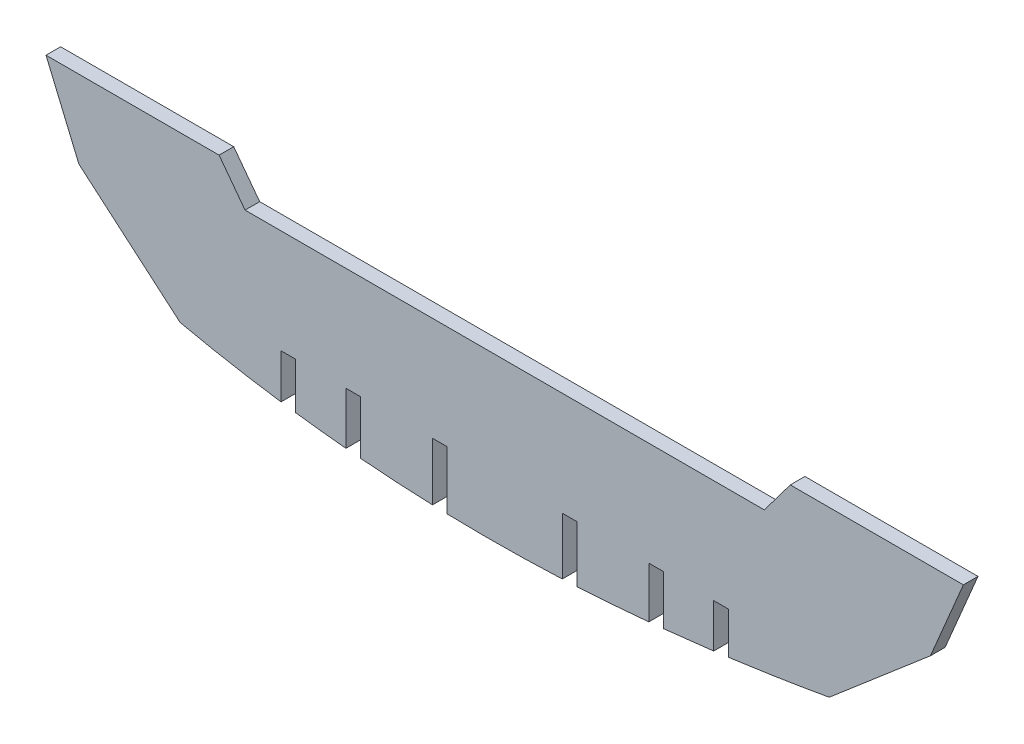
ISO-10303-21;
HEADER;
FILE_DESCRIPTION(('STEP AP214'),'2;1');
FILE_NAME('part.step','',(''),(''),'','','');
FILE_SCHEMA(('AUTOMOTIVE_DESIGN { 1 0 10303 214 1 1 1 1 }'));
ENDSEC;
DATA;
#1=APPLICATION_CONTEXT('core data for automotive mechanical design processes');
#2=APPLICATION_PROTOCOL_DEFINITION('international standard','automotive_design',2000,#1);
#3=PRODUCT_CONTEXT('',#1,'mechanical');
#4=PRODUCT('Part','Part','',(#3));
#5=PRODUCT_RELATED_PRODUCT_CATEGORY('part','',(#4));
#6=PRODUCT_DEFINITION_FORMATION('','',#4);
#7=PRODUCT_DEFINITION_CONTEXT('part definition',#1,'design');
#8=PRODUCT_DEFINITION('design','',#6,#7);
#9=PRODUCT_DEFINITION_SHAPE('','',#8);
#10=(LENGTH_UNIT() NAMED_UNIT(*) SI_UNIT(.MILLI.,.METRE.));
#11=(NAMED_UNIT(*) PLANE_ANGLE_UNIT() SI_UNIT($,.RADIAN.));
#12=(NAMED_UNIT(*) SI_UNIT($,.STERADIAN.) SOLID_ANGLE_UNIT());
#13=UNCERTAINTY_MEASURE_WITH_UNIT(LENGTH_MEASURE(1.E-05),#10,'distance_accuracy_value','');
#14=(GEOMETRIC_REPRESENTATION_CONTEXT(3) GLOBAL_UNCERTAINTY_ASSIGNED_CONTEXT((#13)) GLOBAL_UNIT_ASSIGNED_CONTEXT((#10,
#11,#12)) REPRESENTATION_CONTEXT('',''));
#15=CARTESIAN_POINT('',(0.,0.,0.));
#16=DIRECTION('',(0.,0.,1.));
#17=DIRECTION('',(1.,0.,0.));
#18=AXIS2_PLACEMENT_3D('',#15,#16,#17);
#19=CARTESIAN_POINT('',(-95.25,-19.05,4.2926));
#20=CARTESIAN_POINT('',(-66.0792350111344,-25.5146809383429,4.2926));
#21=CARTESIAN_POINT('',(-2.12159073980995,-32.083739423019,4.2926));
#22=CARTESIAN_POINT('',(61.7618618980102,-25.0102467709334,4.2926));
#23=CARTESIAN_POINT('',(95.25,-19.05,4.2926));
#24=B_SPLINE_CURVE_WITH_KNOTS('',3,(#19,#20,#21,#22,#23),.UNSPECIFIED.,.F.,.F.,(4,1,4),(0.,
0.46719867774018,1.),.UNSPECIFIED.);
#25=DIRECTION('',(0.,0.,-1.));
#26=VECTOR('',#25,1.);
#27=SURFACE_OF_LINEAR_EXTRUSION('',#24,#26);
#28=CARTESIAN_POINT('',(-61.3537,-25.0213087322138,4.2926));
#29=VERTEX_POINT('',#28);
#30=CARTESIAN_POINT('',(-46.5963,-26.7045433789957,4.2926));
#31=VERTEX_POINT('',#30);
#32=EDGE_CURVE('E399',#29,#31,#24,.T.);
#33=ORIENTED_EDGE('',*,*,#32,.F.);
#34=DIRECTION('',(0.,0.,-1.));
#35=VECTOR('',#34,1.);
#36=CARTESIAN_POINT('',(-61.3537,-25.0213087322138,4.2926));
#37=LINE('',#36,#35);
#38=CARTESIAN_POINT('',(-61.3537,-25.0213087322138,0.));
#39=VERTEX_POINT('',#38);
#40=EDGE_CURVE('E385',#29,#39,#37,.T.);
#41=ORIENTED_EDGE('',*,*,#40,.T.);
#42=CARTESIAN_POINT('',(-95.25,-19.05,0.));
#43=CARTESIAN_POINT('',(-66.0792350111344,-25.5146809383429,0.));
#44=CARTESIAN_POINT('',(-2.12159073980995,-32.083739423019,0.));
#45=CARTESIAN_POINT('',(61.7618618980102,-25.0102467709334,0.));
#46=CARTESIAN_POINT('',(95.25,-19.05,0.));
#47=B_SPLINE_CURVE_WITH_KNOTS('',3,(#42,#43,#44,#45,#46),.UNSPECIFIED.,.F.,.F.,(4,1,4),(0.,
0.46719867774018,1.),.UNSPECIFIED.);
#48=CARTESIAN_POINT('',(-46.5963,-26.7045433789957,0.));
#49=VERTEX_POINT('',#48);
#50=EDGE_CURVE('E279',#39,#49,#47,.T.);
#51=ORIENTED_EDGE('',*,*,#50,.T.);
#52=DIRECTION('',(0.,0.,-1.));
#53=VECTOR('',#52,1.);
#54=CARTESIAN_POINT('',(-46.5963,-26.7045433789957,4.2926));
#55=LINE('',#54,#53);
#56=EDGE_CURVE('E442',#49,#31,#55,.F.);
#57=ORIENTED_EDGE('',*,*,#56,.T.);
#58=EDGE_LOOP('',(#33,#41,#51,#57));
#59=FACE_BOUND('',#58,.T.);
#60=ADVANCED_FACE('F37',(#59),#27,.F.);
#61=CARTESIAN_POINT('',(21.1963,-27.9476728082947,4.2926));
#62=VERTEX_POINT('',#61);
#63=CARTESIAN_POINT('',(42.3037,-26.3654884719397,4.2926));
#64=VERTEX_POINT('',#63);
#65=EDGE_CURVE('E380',#62,#64,#24,.T.);
#66=ORIENTED_EDGE('',*,*,#65,.F.);
#67=DIRECTION('',(0.,0.,-1.));
#68=VECTOR('',#67,1.);
#69=CARTESIAN_POINT('',(21.1963,-27.9476728082947,4.2926));
#70=LINE('',#69,#68);
#71=CARTESIAN_POINT('',(21.1963,-27.9476728082947,0.));
#72=VERTEX_POINT('',#71);
#73=EDGE_CURVE('E371',#62,#72,#70,.T.);
#74=ORIENTED_EDGE('',*,*,#73,.T.);
#75=CARTESIAN_POINT('',(42.3037,-26.3654884719397,0.));
#76=VERTEX_POINT('',#75);
#77=EDGE_CURVE('E367',#72,#76,#47,.T.);
#78=ORIENTED_EDGE('',*,*,#77,.T.);
#79=DIRECTION('',(0.,0.,-1.));
#80=VECTOR('',#79,1.);
#81=CARTESIAN_POINT('',(42.3037,-26.3654884719397,4.2926));
#82=LINE('',#81,#80);
#83=EDGE_CURVE('E533',#76,#64,#82,.F.);
#84=ORIENTED_EDGE('',*,*,#83,.T.);
#85=EDGE_LOOP('',(#66,#74,#78,#84));
#86=FACE_BOUND('',#85,.T.);
#87=ADVANCED_FACE('F377',(#86),#27,.F.);
#88=CARTESIAN_POINT('',(65.6463,-23.6876563359909,4.2926));
#89=VERTEX_POINT('',#88);
#90=CARTESIAN_POINT('',(95.25,-19.05,4.2926));
#91=VERTEX_POINT('',#90);
#92=EDGE_CURVE('E325',#89,#91,#24,.T.);
#93=ORIENTED_EDGE('',*,*,#92,.F.);
#94=DIRECTION('',(0.,0.,-1.));
#95=VECTOR('',#94,1.);
#96=CARTESIAN_POINT('',(65.6463,-23.687656335991,4.2926));
#97=LINE('',#96,#95);
#98=CARTESIAN_POINT('',(65.6463,-23.6876563359909,0.));
#99=VERTEX_POINT('',#98);
#100=EDGE_CURVE('E388',#89,#99,#97,.T.);
#101=ORIENTED_EDGE('',*,*,#100,.T.);
#102=CARTESIAN_POINT('',(95.25,-19.05,0.));
#103=VERTEX_POINT('',#102);
#104=EDGE_CURVE('E289',#99,#103,#47,.T.);
#105=ORIENTED_EDGE('',*,*,#104,.T.);
#106=DIRECTION('',(0.,0.,-1.));
#107=VECTOR('',#106,1.);
#108=CARTESIAN_POINT('',(95.25,-19.05,4.2926));
#109=LINE('',#108,#107);
#110=EDGE_CURVE('E346',#91,#103,#109,.T.);
#111=ORIENTED_EDGE('',*,*,#110,.F.);
#112=EDGE_LOOP('',(#93,#101,#105,#111));
#113=FACE_BOUND('',#112,.T.);
#114=ADVANCED_FACE('F544',(#113),#27,.F.);
#115=CARTESIAN_POINT('',(46.5963,-25.9432766219604,0.));
#116=VERTEX_POINT('',#115);
#117=CARTESIAN_POINT('',(61.3537,-24.2486576336705,0.));
#118=VERTEX_POINT('',#117);
#119=EDGE_CURVE('E549',#116,#118,#47,.T.);
#120=ORIENTED_EDGE('',*,*,#119,.T.);
#121=DIRECTION('',(0.,0.,-1.));
#122=VECTOR('',#121,1.);
#123=CARTESIAN_POINT('',(61.3537,-24.2486576336705,4.2926));
#124=LINE('',#123,#122);
#125=CARTESIAN_POINT('',(61.3537,-24.2486576336705,4.2926));
#126=VERTEX_POINT('',#125);
#127=EDGE_CURVE('E538',#118,#126,#124,.F.);
#128=ORIENTED_EDGE('',*,*,#127,.T.);
#129=CARTESIAN_POINT('',(46.5963,-25.9432766219604,4.2926));
#130=VERTEX_POINT('',#129);
#131=EDGE_CURVE('E591',#130,#126,#24,.T.);
#132=ORIENTED_EDGE('',*,*,#131,.F.);
#133=DIRECTION('',(0.,0.,-1.));
#134=VECTOR('',#133,1.);
#135=CARTESIAN_POINT('',(46.5963000000001,-25.9432766219604,4.2926));
#136=LINE('',#135,#134);
#137=EDGE_CURVE('E535',#130,#116,#136,.T.);
#138=ORIENTED_EDGE('',*,*,#137,.T.);
#139=EDGE_LOOP('',(#120,#128,#132,#138));
#140=FACE_BOUND('',#139,.T.);
#141=ADVANCED_FACE('F650',(#140),#27,.F.);
#142=CARTESIAN_POINT('',(-16.9037,-28.5176362998393,0.));
#143=VERTEX_POINT('',#142);
#144=CARTESIAN_POINT('',(16.9037,-28.1643569932418,0.));
#145=VERTEX_POINT('',#144);
#146=EDGE_CURVE('E291',#143,#145,#47,.T.);
#147=ORIENTED_EDGE('',*,*,#146,.T.);
#148=DIRECTION('',(0.,0.,-1.));
#149=VECTOR('',#148,1.);
#150=CARTESIAN_POINT('',(16.9037,-28.1643569932418,4.2926));
#151=LINE('',#150,#149);
#152=CARTESIAN_POINT('',(16.9037,-28.1643569932418,4.2926));
#153=VERTEX_POINT('',#152);
#154=EDGE_CURVE('E382',#145,#153,#151,.F.);
#155=ORIENTED_EDGE('',*,*,#154,.T.);
#156=CARTESIAN_POINT('',(-16.9037,-28.5176362998393,4.2926));
#157=VERTEX_POINT('',#156);
#158=EDGE_CURVE('E589',#157,#153,#24,.T.);
#159=ORIENTED_EDGE('',*,*,#158,.F.);
#160=DIRECTION('',(0.,0.,-1.));
#161=VECTOR('',#160,1.);
#162=CARTESIAN_POINT('',(-16.9037,-28.5176362998393,4.2926));
#163=LINE('',#162,#161);
#164=EDGE_CURVE('E530',#157,#143,#163,.T.);
#165=ORIENTED_EDGE('',*,*,#164,.T.);
#166=EDGE_LOOP('',(#147,#155,#159,#165));
#167=FACE_BOUND('',#166,.T.);
#168=ADVANCED_FACE('F556',(#167),#27,.F.);
#169=CARTESIAN_POINT('',(-42.3037,-27.0947511234712,0.));
#170=VERTEX_POINT('',#169);
#171=CARTESIAN_POINT('',(-21.1963,-28.3817433657437,0.));
#172=VERTEX_POINT('',#171);
#173=EDGE_CURVE('E285',#170,#172,#47,.T.);
#174=ORIENTED_EDGE('',*,*,#173,.T.);
#175=DIRECTION('',(0.,0.,-1.));
#176=VECTOR('',#175,1.);
#177=CARTESIAN_POINT('',(-21.1963,-28.3817433657437,4.2926));
#178=LINE('',#177,#176);
#179=CARTESIAN_POINT('',(-21.1963,-28.3817433657437,4.2926));
#180=VERTEX_POINT('',#179);
#181=EDGE_CURVE('E527',#172,#180,#178,.F.);
#182=ORIENTED_EDGE('',*,*,#181,.T.);
#183=CARTESIAN_POINT('',(-42.3037,-27.0947511234712,4.2926));
#184=VERTEX_POINT('',#183);
#185=EDGE_CURVE('E575',#184,#180,#24,.T.);
#186=ORIENTED_EDGE('',*,*,#185,.F.);
#187=DIRECTION('',(0.,0.,-1.));
#188=VECTOR('',#187,1.);
#189=CARTESIAN_POINT('',(-42.3037,-27.0947511234712,4.2926));
#190=LINE('',#189,#188);
#191=EDGE_CURVE('E524',#184,#170,#190,.T.);
#192=ORIENTED_EDGE('',*,*,#191,.T.);
#193=EDGE_LOOP('',(#174,#182,#186,#192));
#194=FACE_BOUND('',#193,.T.);
#195=ADVANCED_FACE('F572',(#194),#27,.F.);
#196=CARTESIAN_POINT('',(-95.25,-19.05,0.));
#197=VERTEX_POINT('',#196);
#198=CARTESIAN_POINT('',(-65.6463,-24.4302717503621,0.));
#199=VERTEX_POINT('',#198);
#200=EDGE_CURVE('E284',#197,#199,#47,.T.);
#201=ORIENTED_EDGE('',*,*,#200,.T.);
#202=DIRECTION('',(0.,0.,-1.));
#203=VECTOR('',#202,1.);
#204=CARTESIAN_POINT('',(-65.6463,-24.4302717503621,4.2926));
#205=LINE('',#204,#203);
#206=CARTESIAN_POINT('',(-65.6463,-24.4302717503621,4.2926));
#207=VERTEX_POINT('',#206);
#208=EDGE_CURVE('E381',#199,#207,#205,.F.);
#209=ORIENTED_EDGE('',*,*,#208,.T.);
#210=CARTESIAN_POINT('',(-95.25,-19.05,4.2926));
#211=VERTEX_POINT('',#210);
#212=EDGE_CURVE('E392',#211,#207,#24,.T.);
#213=ORIENTED_EDGE('',*,*,#212,.F.);
#214=DIRECTION('',(0.,0.,-1.));
#215=VECTOR('',#214,1.);
#216=CARTESIAN_POINT('',(-95.25,-19.05,4.2926));
#217=LINE('',#216,#215);
#218=EDGE_CURVE('E326',#211,#197,#217,.T.);
#219=ORIENTED_EDGE('',*,*,#218,.T.);
#220=EDGE_LOOP('',(#201,#209,#213,#219));
#221=FACE_BOUND('',#220,.T.);
#222=ADVANCED_FACE('F39',(#221),#27,.F.);
#223=CARTESIAN_POINT('',(49.6173329393389,-58.0522795390266,4.2926));
#224=DIRECTION('',(0.649720599003113,-0.760173100833643,0.));
#225=DIRECTION('',(0.760173100833643,0.649720599003113,0.));
#226=AXIS2_PLACEMENT_3D('',#223,#224,#225);
#227=PLANE('',#226);
#228=DIRECTION('',(-0.760173100833643,-0.649720599003113,0.));
#229=VECTOR('',#228,1.);
#230=CARTESIAN_POINT('',(49.6173329393389,-58.0522795390266,0.));
#231=LINE('',#230,#229);
#232=CARTESIAN_POINT('',(124.968,6.35,0.));
#233=VERTEX_POINT('',#232);
#234=EDGE_CURVE('E288',#233,#103,#231,.T.);
#235=ORIENTED_EDGE('',*,*,#234,.F.);
#236=DIRECTION('',(0.,0.,-1.));
#237=VECTOR('',#236,1.);
#238=CARTESIAN_POINT('',(124.968,6.35,4.2926));
#239=LINE('',#238,#237);
#240=CARTESIAN_POINT('',(124.968,6.35,4.2926));
#241=VERTEX_POINT('',#240);
#242=EDGE_CURVE('E344',#241,#233,#239,.T.);
#243=ORIENTED_EDGE('',*,*,#242,.F.);
#244=DIRECTION('',(-0.760173100833643,-0.649720599003113,0.));
#245=VECTOR('',#244,1.);
#246=CARTESIAN_POINT('',(49.6173329393389,-58.0522795390266,4.2926));
#247=LINE('',#246,#245);
#248=EDGE_CURVE('E398',#241,#91,#247,.T.);
#249=ORIENTED_EDGE('',*,*,#248,.T.);
#250=ORIENTED_EDGE('',*,*,#110,.T.);
#251=EDGE_LOOP('',(#235,#243,#249,#250));
#252=FACE_BOUND('',#251,.T.);
#253=ADVANCED_FACE('F601',(#252),#227,.T.);
#254=CARTESIAN_POINT('',(103.784974853311,-43.8203227158424,4.2926));
#255=DIRECTION('',(0.921249561411386,-0.388972037040363,0.));
#256=DIRECTION('',(0.388972037040363,0.921249561411386,0.));
#257=AXIS2_PLACEMENT_3D('',#254,#255,#256);
#258=PLANE('',#257);
#259=DIRECTION('',(-0.388972037040363,-0.921249561411386,0.));
#260=VECTOR('',#259,1.);
#261=CARTESIAN_POINT('',(103.784974853311,-43.8203227158424,0.));
#262=LINE('',#261,#260);
#263=CARTESIAN_POINT('',(134.62,29.21,0.));
#264=VERTEX_POINT('',#263);
#265=EDGE_CURVE('E303',#264,#233,#262,.T.);
#266=ORIENTED_EDGE('',*,*,#265,.F.);
#267=DIRECTION('',(0.,0.,-1.));
#268=VECTOR('',#267,1.);
#269=CARTESIAN_POINT('',(134.62,29.21,4.2926));
#270=LINE('',#269,#268);
#271=CARTESIAN_POINT('',(134.62,29.21,4.2926));
#272=VERTEX_POINT('',#271);
#273=EDGE_CURVE('E342',#272,#264,#270,.T.);
#274=ORIENTED_EDGE('',*,*,#273,.F.);
#275=DIRECTION('',(-0.388972037040363,-0.921249561411386,0.));
#276=VECTOR('',#275,1.);
#277=CARTESIAN_POINT('',(103.784974853311,-43.8203227158424,4.2926));
#278=LINE('',#277,#276);
#279=EDGE_CURVE('E405',#272,#241,#278,.T.);
#280=ORIENTED_EDGE('',*,*,#279,.T.);
#281=ORIENTED_EDGE('',*,*,#242,.T.);
#282=EDGE_LOOP('',(#266,#274,#280,#281));
#283=FACE_BOUND('',#282,.T.);
#284=ADVANCED_FACE('F604',(#283),#258,.T.);
#285=CARTESIAN_POINT('',(0.,29.21,4.2926));
#286=DIRECTION('',(0.,1.,0.));
#287=DIRECTION('',(0.,0.,1.));
#288=AXIS2_PLACEMENT_3D('',#285,#286,#287);
#289=PLANE('',#288);
#290=DIRECTION('',(1.,0.,0.));
#291=VECTOR('',#290,1.);
#292=CARTESIAN_POINT('',(0.,29.21,0.));
#293=LINE('',#292,#291);
#294=CARTESIAN_POINT('',(83.82,29.21,0.));
#295=VERTEX_POINT('',#294);
#296=EDGE_CURVE('E306',#295,#264,#293,.T.);
#297=ORIENTED_EDGE('',*,*,#296,.F.);
#298=DIRECTION('',(0.,0.,-1.));
#299=VECTOR('',#298,1.);
#300=CARTESIAN_POINT('',(83.82,29.21,4.2926));
#301=LINE('',#300,#299);
#302=CARTESIAN_POINT('',(83.82,29.21,4.2926));
#303=VERTEX_POINT('',#302);
#304=EDGE_CURVE('E340',#303,#295,#301,.T.);
#305=ORIENTED_EDGE('',*,*,#304,.F.);
#306=DIRECTION('',(1.,0.,0.));
#307=VECTOR('',#306,1.);
#308=CARTESIAN_POINT('',(0.,29.21,4.2926));
#309=LINE('',#308,#307);
#310=EDGE_CURVE('E408',#303,#272,#309,.T.);
#311=ORIENTED_EDGE('',*,*,#310,.T.);
#312=ORIENTED_EDGE('',*,*,#273,.T.);
#313=EDGE_LOOP('',(#297,#305,#311,#312));
#314=FACE_BOUND('',#313,.T.);
#315=ADVANCED_FACE('F609',(#314),#289,.T.);
#316=CARTESIAN_POINT('',(39.624,-29.718,4.2926));
#317=DIRECTION('',(-0.8,0.6,0.));
#318=DIRECTION('',(-0.6,-0.8,0.));
#319=AXIS2_PLACEMENT_3D('',#316,#317,#318);
#320=PLANE('',#319);
#321=DIRECTION('',(0.6,0.8,0.));
#322=VECTOR('',#321,1.);
#323=CARTESIAN_POINT('',(39.624,-29.718,0.));
#324=LINE('',#323,#322);
#325=CARTESIAN_POINT('',(76.2,19.05,0.));
#326=VERTEX_POINT('',#325);
#327=EDGE_CURVE('E309',#326,#295,#324,.T.);
#328=ORIENTED_EDGE('',*,*,#327,.F.);
#329=DIRECTION('',(0.,0.,-1.));
#330=VECTOR('',#329,1.);
#331=CARTESIAN_POINT('',(76.2,19.05,4.2926));
#332=LINE('',#331,#330);
#333=CARTESIAN_POINT('',(76.2,19.05,4.2926));
#334=VERTEX_POINT('',#333);
#335=EDGE_CURVE('E338',#334,#326,#332,.T.);
#336=ORIENTED_EDGE('',*,*,#335,.F.);
#337=DIRECTION('',(0.6,0.8,0.));
#338=VECTOR('',#337,1.);
#339=CARTESIAN_POINT('',(39.624,-29.718,4.2926));
#340=LINE('',#339,#338);
#341=EDGE_CURVE('E411',#334,#303,#340,.T.);
#342=ORIENTED_EDGE('',*,*,#341,.T.);
#343=ORIENTED_EDGE('',*,*,#304,.T.);
#344=EDGE_LOOP('',(#328,#336,#342,#343));
#345=FACE_BOUND('',#344,.T.);
#346=ADVANCED_FACE('F612',(#345),#320,.T.);
#347=CARTESIAN_POINT('',(0.,19.05,4.2926));
#348=DIRECTION('',(0.,1.,0.));
#349=DIRECTION('',(0.,0.,1.));
#350=AXIS2_PLACEMENT_3D('',#347,#348,#349);
#351=PLANE('',#350);
#352=DIRECTION('',(1.,0.,0.));
#353=VECTOR('',#352,1.);
#354=CARTESIAN_POINT('',(0.,19.05,0.));
#355=LINE('',#354,#353);
#356=CARTESIAN_POINT('',(-76.2,19.05,0.));
#357=VERTEX_POINT('',#356);
#358=EDGE_CURVE('E312',#357,#326,#355,.T.);
#359=ORIENTED_EDGE('',*,*,#358,.F.);
#360=DIRECTION('',(0.,0.,-1.));
#361=VECTOR('',#360,1.);
#362=CARTESIAN_POINT('',(-76.2,19.05,4.2926));
#363=LINE('',#362,#361);
#364=CARTESIAN_POINT('',(-76.2,19.05,4.2926));
#365=VERTEX_POINT('',#364);
#366=EDGE_CURVE('E336',#365,#357,#363,.T.);
#367=ORIENTED_EDGE('',*,*,#366,.F.);
#368=DIRECTION('',(1.,0.,0.));
#369=VECTOR('',#368,1.);
#370=CARTESIAN_POINT('',(0.,19.05,4.2926));
#371=LINE('',#370,#369);
#372=EDGE_CURVE('E414',#365,#334,#371,.T.);
#373=ORIENTED_EDGE('',*,*,#372,.T.);
#374=ORIENTED_EDGE('',*,*,#335,.T.);
#375=EDGE_LOOP('',(#359,#367,#373,#374));
#376=FACE_BOUND('',#375,.T.);
#377=ADVANCED_FACE('F616',(#376),#351,.T.);
#378=CARTESIAN_POINT('',(-39.624,-29.718,4.2926));
#379=DIRECTION('',(-0.8,-0.6,0.));
#380=DIRECTION('',(0.6,-0.8,0.));
#381=AXIS2_PLACEMENT_3D('',#378,#379,#380);
#382=PLANE('',#381);
#383=DIRECTION('',(-0.6,0.8,0.));
#384=VECTOR('',#383,1.);
#385=CARTESIAN_POINT('',(-39.624,-29.718,0.));
#386=LINE('',#385,#384);
#387=CARTESIAN_POINT('',(-83.82,29.21,0.));
#388=VERTEX_POINT('',#387);
#389=EDGE_CURVE('E315',#357,#388,#386,.T.);
#390=ORIENTED_EDGE('',*,*,#389,.T.);
#391=DIRECTION('',(0.,0.,-1.));
#392=VECTOR('',#391,1.);
#393=CARTESIAN_POINT('',(-83.82,29.21,4.2926));
#394=LINE('',#393,#392);
#395=CARTESIAN_POINT('',(-83.82,29.21,4.2926));
#396=VERTEX_POINT('',#395);
#397=EDGE_CURVE('E333',#396,#388,#394,.T.);
#398=ORIENTED_EDGE('',*,*,#397,.F.);
#399=DIRECTION('',(-0.6,0.8,0.));
#400=VECTOR('',#399,1.);
#401=CARTESIAN_POINT('',(-39.624,-29.718,4.2926));
#402=LINE('',#401,#400);
#403=EDGE_CURVE('E417',#365,#396,#402,.T.);
#404=ORIENTED_EDGE('',*,*,#403,.F.);
#405=ORIENTED_EDGE('',*,*,#366,.T.);
#406=EDGE_LOOP('',(#390,#398,#404,#405));
#407=FACE_BOUND('',#406,.T.);
#408=ADVANCED_FACE('F621',(#407),#382,.F.);
#409=CARTESIAN_POINT('',(0.,29.21,4.2926));
#410=DIRECTION('',(0.,-1.,0.));
#411=DIRECTION('',(1.,0.,0.));
#412=AXIS2_PLACEMENT_3D('',#409,#410,#411);
#413=PLANE('',#412);
#414=DIRECTION('',(-1.,0.,0.));
#415=VECTOR('',#414,1.);
#416=CARTESIAN_POINT('',(0.,29.21,0.));
#417=LINE('',#416,#415);
#418=CARTESIAN_POINT('',(-134.62,29.21,0.));
#419=VERTEX_POINT('',#418);
#420=EDGE_CURVE('E317',#388,#419,#417,.T.);
#421=ORIENTED_EDGE('',*,*,#420,.T.);
#422=DIRECTION('',(0.,0.,-1.));
#423=VECTOR('',#422,1.);
#424=CARTESIAN_POINT('',(-134.62,29.21,4.2926));
#425=LINE('',#424,#423);
#426=CARTESIAN_POINT('',(-134.62,29.21,4.2926));
#427=VERTEX_POINT('',#426);
#428=EDGE_CURVE('E330',#427,#419,#425,.T.);
#429=ORIENTED_EDGE('',*,*,#428,.F.);
#430=DIRECTION('',(-1.,0.,0.));
#431=VECTOR('',#430,1.);
#432=CARTESIAN_POINT('',(0.,29.21,4.2926));
#433=LINE('',#432,#431);
#434=EDGE_CURVE('E419',#396,#427,#433,.T.);
#435=ORIENTED_EDGE('',*,*,#434,.F.);
#436=ORIENTED_EDGE('',*,*,#397,.T.);
#437=EDGE_LOOP('',(#421,#429,#435,#436));
#438=FACE_BOUND('',#437,.T.);
#439=ADVANCED_FACE('F625',(#438),#413,.F.);
#440=CARTESIAN_POINT('',(-103.784974853311,-43.8203227158424,4.2926));
#441=DIRECTION('',(0.921249561411386,0.388972037040363,0.));
#442=DIRECTION('',(-0.388972037040363,0.921249561411386,0.));
#443=AXIS2_PLACEMENT_3D('',#440,#441,#442);
#444=PLANE('',#443);
#445=DIRECTION('',(0.388972037040363,-0.921249561411386,0.));
#446=VECTOR('',#445,1.);
#447=CARTESIAN_POINT('',(-103.784974853311,-43.8203227158424,0.));
#448=LINE('',#447,#446);
#449=CARTESIAN_POINT('',(-124.968,6.35,0.));
#450=VERTEX_POINT('',#449);
#451=EDGE_CURVE('E319',#419,#450,#448,.T.);
#452=ORIENTED_EDGE('',*,*,#451,.T.);
#453=DIRECTION('',(0.,0.,-1.));
#454=VECTOR('',#453,1.);
#455=CARTESIAN_POINT('',(-124.968,6.35,4.2926));
#456=LINE('',#455,#454);
#457=CARTESIAN_POINT('',(-124.968,6.35,4.2926));
#458=VERTEX_POINT('',#457);
#459=EDGE_CURVE('E328',#458,#450,#456,.T.);
#460=ORIENTED_EDGE('',*,*,#459,.F.);
#461=DIRECTION('',(0.388972037040363,-0.921249561411386,0.));
#462=VECTOR('',#461,1.);
#463=CARTESIAN_POINT('',(-103.784974853311,-43.8203227158424,4.2926));
#464=LINE('',#463,#462);
#465=EDGE_CURVE('E420',#427,#458,#464,.T.);
#466=ORIENTED_EDGE('',*,*,#465,.F.);
#467=ORIENTED_EDGE('',*,*,#428,.T.);
#468=EDGE_LOOP('',(#452,#460,#466,#467));
#469=FACE_BOUND('',#468,.T.);
#470=ADVANCED_FACE('F629',(#469),#444,.F.);
#471=CARTESIAN_POINT('',(-49.6173329393389,-58.0522795390266,4.2926));
#472=DIRECTION('',(-0.649720599003113,-0.760173100833643,0.));
#473=DIRECTION('',(0.760173100833643,-0.649720599003113,0.));
#474=AXIS2_PLACEMENT_3D('',#471,#472,#473);
#475=PLANE('',#474);
#476=DIRECTION('',(-0.760173100833643,0.649720599003113,0.));
#477=VECTOR('',#476,1.);
#478=CARTESIAN_POINT('',(-49.6173329393389,-58.0522795390266,0.));
#479=LINE('',#478,#477);
#480=EDGE_CURVE('E322',#197,#450,#479,.T.);
#481=ORIENTED_EDGE('',*,*,#480,.F.);
#482=ORIENTED_EDGE('',*,*,#218,.F.);
#483=DIRECTION('',(-0.760173100833643,0.649720599003113,0.));
#484=VECTOR('',#483,1.);
#485=CARTESIAN_POINT('',(-49.6173329393389,-58.0522795390266,4.2926));
#486=LINE('',#485,#484);
#487=EDGE_CURVE('E296',#211,#458,#486,.T.);
#488=ORIENTED_EDGE('',*,*,#487,.T.);
#489=ORIENTED_EDGE('',*,*,#459,.T.);
#490=EDGE_LOOP('',(#481,#482,#488,#489));
#491=FACE_BOUND('',#490,.T.);
#492=ADVANCED_FACE('F428',(#491),#475,.T.);
#493=CARTESIAN_POINT('',(0.,0.,4.2926));
#494=DIRECTION('',(0.,0.,1.));
#495=DIRECTION('',(1.,0.,0.));
#496=AXIS2_PLACEMENT_3D('',#493,#494,#495);
#497=PLANE('',#496);
#498=DIRECTION('',(0.,1.,0.));
#499=VECTOR('',#498,1.);
#500=CARTESIAN_POINT('',(-61.3537,-31.75,4.2926));
#501=LINE('',#500,#499);
#502=CARTESIAN_POINT('',(-61.3537,-11.43,4.2926));
#503=VERTEX_POINT('',#502);
#504=EDGE_CURVE('E263',#29,#503,#501,.T.);
#505=ORIENTED_EDGE('',*,*,#504,.F.);
#506=ORIENTED_EDGE('',*,*,#32,.T.);
#507=DIRECTION('',(0.,-1.,0.));
#508=VECTOR('',#507,1.);
#509=CARTESIAN_POINT('',(-46.5963,-31.75,4.2926));
#510=LINE('',#509,#508);
#511=CARTESIAN_POINT('',(-46.5963,-11.43,4.2926));
#512=VERTEX_POINT('',#511);
#513=EDGE_CURVE('E459',#512,#31,#510,.T.);
#514=ORIENTED_EDGE('',*,*,#513,.F.);
#515=DIRECTION('',(-1.,0.,0.));
#516=VECTOR('',#515,1.);
#517=CARTESIAN_POINT('',(-46.5963,-11.43,4.2926));
#518=LINE('',#517,#516);
#519=CARTESIAN_POINT('',(-42.3037,-11.43,4.2926));
#520=VERTEX_POINT('',#519);
#521=EDGE_CURVE('E464',#520,#512,#518,.T.);
#522=ORIENTED_EDGE('',*,*,#521,.F.);
#523=DIRECTION('',(0.,1.,0.));
#524=VECTOR('',#523,1.);
#525=CARTESIAN_POINT('',(-42.3037,-31.75,4.2926));
#526=LINE('',#525,#524);
#527=EDGE_CURVE('E462',#184,#520,#526,.T.);
#528=ORIENTED_EDGE('',*,*,#527,.F.);
#529=ORIENTED_EDGE('',*,*,#185,.T.);
#530=DIRECTION('',(0.,-1.,0.));
#531=VECTOR('',#530,1.);
#532=CARTESIAN_POINT('',(-21.1963,-11.43,4.2926));
#533=LINE('',#532,#531);
#534=CARTESIAN_POINT('',(-21.1963,-11.43,4.2926));
#535=VERTEX_POINT('',#534);
#536=EDGE_CURVE('E476',#535,#180,#533,.T.);
#537=ORIENTED_EDGE('',*,*,#536,.F.);
#538=DIRECTION('',(-1.,0.,0.));
#539=VECTOR('',#538,1.);
#540=CARTESIAN_POINT('',(-21.1963,-11.43,4.2926));
#541=LINE('',#540,#539);
#542=CARTESIAN_POINT('',(-16.9037,-11.43,4.2926));
#543=VERTEX_POINT('',#542);
#544=EDGE_CURVE('E482',#543,#535,#541,.T.);
#545=ORIENTED_EDGE('',*,*,#544,.F.);
#546=DIRECTION('',(0.,1.,0.));
#547=VECTOR('',#546,1.);
#548=CARTESIAN_POINT('',(-16.9037,-11.43,4.2926));
#549=LINE('',#548,#547);
#550=EDGE_CURVE('E480',#157,#543,#549,.T.);
#551=ORIENTED_EDGE('',*,*,#550,.F.);
#552=ORIENTED_EDGE('',*,*,#158,.T.);
#553=DIRECTION('',(0.,-1.,0.));
#554=VECTOR('',#553,1.);
#555=CARTESIAN_POINT('',(16.9037,-11.43,4.2926));
#556=LINE('',#555,#554);
#557=CARTESIAN_POINT('',(16.9037,-11.43,4.2926));
#558=VERTEX_POINT('',#557);
#559=EDGE_CURVE('E445',#558,#153,#556,.T.);
#560=ORIENTED_EDGE('',*,*,#559,.F.);
#561=DIRECTION('',(-1.,0.,0.));
#562=VECTOR('',#561,1.);
#563=CARTESIAN_POINT('',(16.9037,-11.43,4.2926));
#564=LINE('',#563,#562);
#565=CARTESIAN_POINT('',(21.1963,-11.43,4.2926));
#566=VERTEX_POINT('',#565);
#567=EDGE_CURVE('E449',#566,#558,#564,.T.);
#568=ORIENTED_EDGE('',*,*,#567,.F.);
#569=DIRECTION('',(0.,1.,0.));
#570=VECTOR('',#569,1.);
#571=CARTESIAN_POINT('',(21.1963,-11.43,4.2926));
#572=LINE('',#571,#570);
#573=EDGE_CURVE('E447',#62,#566,#572,.T.);
#574=ORIENTED_EDGE('',*,*,#573,.F.);
#575=ORIENTED_EDGE('',*,*,#65,.T.);
#576=DIRECTION('',(0.,-1.,0.));
#577=VECTOR('',#576,1.);
#578=CARTESIAN_POINT('',(42.3037,-11.43,4.2926));
#579=LINE('',#578,#577);
#580=CARTESIAN_POINT('',(42.3037,-11.43,4.2926));
#581=VERTEX_POINT('',#580);
#582=EDGE_CURVE('E494',#581,#64,#579,.T.);
#583=ORIENTED_EDGE('',*,*,#582,.F.);
#584=DIRECTION('',(-1.,0.,0.));
#585=VECTOR('',#584,1.);
#586=CARTESIAN_POINT('',(42.3037,-11.43,4.2926));
#587=LINE('',#586,#585);
#588=CARTESIAN_POINT('',(46.5963,-11.43,4.2926));
#589=VERTEX_POINT('',#588);
#590=EDGE_CURVE('E499',#589,#581,#587,.T.);
#591=ORIENTED_EDGE('',*,*,#590,.F.);
#592=DIRECTION('',(0.,1.,0.));
#593=VECTOR('',#592,1.);
#594=CARTESIAN_POINT('',(46.5963,-11.43,4.2926));
#595=LINE('',#594,#593);
#596=EDGE_CURVE('E497',#130,#589,#595,.T.);
#597=ORIENTED_EDGE('',*,*,#596,.F.);
#598=ORIENTED_EDGE('',*,*,#131,.T.);
#599=DIRECTION('',(0.,-1.,0.));
#600=VECTOR('',#599,1.);
#601=CARTESIAN_POINT('',(61.3537,-11.43,4.2926));
#602=LINE('',#601,#600);
#603=CARTESIAN_POINT('',(61.3537,-11.43,4.2926));
#604=VERTEX_POINT('',#603);
#605=EDGE_CURVE('E511',#604,#126,#602,.T.);
#606=ORIENTED_EDGE('',*,*,#605,.F.);
#607=DIRECTION('',(-1.,0.,0.));
#608=VECTOR('',#607,1.);
#609=CARTESIAN_POINT('',(61.3537,-11.43,4.2926));
#610=LINE('',#609,#608);
#611=CARTESIAN_POINT('',(65.6463,-11.43,4.2926));
#612=VERTEX_POINT('',#611);
#613=EDGE_CURVE('E516',#612,#604,#610,.T.);
#614=ORIENTED_EDGE('',*,*,#613,.F.);
#615=DIRECTION('',(0.,1.,0.));
#616=VECTOR('',#615,1.);
#617=CARTESIAN_POINT('',(65.6463,-11.43,4.2926));
#618=LINE('',#617,#616);
#619=EDGE_CURVE('E455',#89,#612,#618,.T.);
#620=ORIENTED_EDGE('',*,*,#619,.F.);
#621=ORIENTED_EDGE('',*,*,#92,.T.);
#622=ORIENTED_EDGE('',*,*,#248,.F.);
#623=ORIENTED_EDGE('',*,*,#279,.F.);
#624=ORIENTED_EDGE('',*,*,#310,.F.);
#625=ORIENTED_EDGE('',*,*,#341,.F.);
#626=ORIENTED_EDGE('',*,*,#372,.F.);
#627=ORIENTED_EDGE('',*,*,#403,.T.);
#628=ORIENTED_EDGE('',*,*,#434,.T.);
#629=ORIENTED_EDGE('',*,*,#465,.T.);
#630=ORIENTED_EDGE('',*,*,#487,.F.);
#631=ORIENTED_EDGE('',*,*,#212,.T.);
#632=DIRECTION('',(0.,-1.,0.));
#633=VECTOR('',#632,1.);
#634=CARTESIAN_POINT('',(-65.6463,-31.75,4.2926));
#635=LINE('',#634,#633);
#636=CARTESIAN_POINT('',(-65.6463,-11.43,4.2926));
#637=VERTEX_POINT('',#636);
#638=EDGE_CURVE('E273',#637,#207,#635,.T.);
#639=ORIENTED_EDGE('',*,*,#638,.F.);
#640=DIRECTION('',(-1.,0.,0.));
#641=VECTOR('',#640,1.);
#642=CARTESIAN_POINT('',(-65.6463,-11.43,4.2926));
#643=LINE('',#642,#641);
#644=EDGE_CURVE('E438',#503,#637,#643,.T.);
#645=ORIENTED_EDGE('',*,*,#644,.F.);
#646=EDGE_LOOP('',(#505,#506,#514,#522,#528,#529,#537,#545,#551,#552,#560,#568,#574,#575,#583,
#591,#597,#598,#606,#614,#620,#621,#622,#623,#624,#625,#626,#627,#628,#629,#630,#631,#639,#645));
#647=FACE_BOUND('',#646,.T.);
#648=ADVANCED_FACE('F430',(#647),#497,.T.);
#649=CARTESIAN_POINT('',(0.,0.,0.));
#650=DIRECTION('',(0.,0.,1.));
#651=DIRECTION('',(1.,0.,0.));
#652=AXIS2_PLACEMENT_3D('',#649,#650,#651);
#653=PLANE('',#652);
#654=ORIENTED_EDGE('',*,*,#50,.F.);
#655=DIRECTION('',(0.,1.,0.));
#656=VECTOR('',#655,1.);
#657=CARTESIAN_POINT('',(-61.3537,0.,0.));
#658=LINE('',#657,#656);
#659=CARTESIAN_POINT('',(-61.3537,-11.43,0.));
#660=VERTEX_POINT('',#659);
#661=EDGE_CURVE('E11',#39,#660,#658,.T.);
#662=ORIENTED_EDGE('',*,*,#661,.T.);
#663=DIRECTION('',(-1.,0.,0.));
#664=VECTOR('',#663,1.);
#665=CARTESIAN_POINT('',(-65.6463,-11.43,0.));
#666=LINE('',#665,#664);
#667=CARTESIAN_POINT('',(-65.6463,-11.43,0.));
#668=VERTEX_POINT('',#667);
#669=EDGE_CURVE('E270',#660,#668,#666,.T.);
#670=ORIENTED_EDGE('',*,*,#669,.T.);
#671=DIRECTION('',(0.,-1.,0.));
#672=VECTOR('',#671,1.);
#673=CARTESIAN_POINT('',(-65.6463,-31.75,0.));
#674=LINE('',#673,#672);
#675=EDGE_CURVE('E53',#668,#199,#674,.T.);
#676=ORIENTED_EDGE('',*,*,#675,.T.);
#677=ORIENTED_EDGE('',*,*,#200,.F.);
#678=ORIENTED_EDGE('',*,*,#480,.T.);
#679=ORIENTED_EDGE('',*,*,#451,.F.);
#680=ORIENTED_EDGE('',*,*,#420,.F.);
#681=ORIENTED_EDGE('',*,*,#389,.F.);
#682=ORIENTED_EDGE('',*,*,#358,.T.);
#683=ORIENTED_EDGE('',*,*,#327,.T.);
#684=ORIENTED_EDGE('',*,*,#296,.T.);
#685=ORIENTED_EDGE('',*,*,#265,.T.);
#686=ORIENTED_EDGE('',*,*,#234,.T.);
#687=ORIENTED_EDGE('',*,*,#104,.F.);
#688=DIRECTION('',(0.,1.,0.));
#689=VECTOR('',#688,1.);
#690=CARTESIAN_POINT('',(65.6463,0.,0.));
#691=LINE('',#690,#689);
#692=CARTESIAN_POINT('',(65.6463,-11.43,0.));
#693=VERTEX_POINT('',#692);
#694=EDGE_CURVE('E358',#99,#693,#691,.T.);
#695=ORIENTED_EDGE('',*,*,#694,.T.);
#696=DIRECTION('',(-1.,0.,0.));
#697=VECTOR('',#696,1.);
#698=CARTESIAN_POINT('',(61.3537,-11.43,0.));
#699=LINE('',#698,#697);
#700=CARTESIAN_POINT('',(61.3537,-11.43,0.));
#701=VERTEX_POINT('',#700);
#702=EDGE_CURVE('E507',#693,#701,#699,.T.);
#703=ORIENTED_EDGE('',*,*,#702,.T.);
#704=DIRECTION('',(0.,-1.,0.));
#705=VECTOR('',#704,1.);
#706=CARTESIAN_POINT('',(61.3537,-11.43,0.));
#707=LINE('',#706,#705);
#708=EDGE_CURVE('E510',#701,#118,#707,.T.);
#709=ORIENTED_EDGE('',*,*,#708,.T.);
#710=ORIENTED_EDGE('',*,*,#119,.F.);
#711=DIRECTION('',(0.,1.,0.));
#712=VECTOR('',#711,1.);
#713=CARTESIAN_POINT('',(46.5963,0.,0.));
#714=LINE('',#713,#712);
#715=CARTESIAN_POINT('',(46.5963,-11.43,0.));
#716=VERTEX_POINT('',#715);
#717=EDGE_CURVE('E355',#116,#716,#714,.T.);
#718=ORIENTED_EDGE('',*,*,#717,.T.);
#719=DIRECTION('',(-1.,0.,0.));
#720=VECTOR('',#719,1.);
#721=CARTESIAN_POINT('',(42.3037,-11.43,0.));
#722=LINE('',#721,#720);
#723=CARTESIAN_POINT('',(42.3037,-11.43,0.));
#724=VERTEX_POINT('',#723);
#725=EDGE_CURVE('E490',#716,#724,#722,.T.);
#726=ORIENTED_EDGE('',*,*,#725,.T.);
#727=DIRECTION('',(0.,-1.,0.));
#728=VECTOR('',#727,1.);
#729=CARTESIAN_POINT('',(42.3037,-11.43,0.));
#730=LINE('',#729,#728);
#731=EDGE_CURVE('E493',#724,#76,#730,.T.);
#732=ORIENTED_EDGE('',*,*,#731,.T.);
#733=ORIENTED_EDGE('',*,*,#77,.F.);
#734=DIRECTION('',(0.,1.,0.));
#735=VECTOR('',#734,1.);
#736=CARTESIAN_POINT('',(21.1963,0.,0.));
#737=LINE('',#736,#735);
#738=CARTESIAN_POINT('',(21.1963,-11.43,0.));
#739=VERTEX_POINT('',#738);
#740=EDGE_CURVE('E46',#72,#739,#737,.T.);
#741=ORIENTED_EDGE('',*,*,#740,.T.);
#742=DIRECTION('',(-1.,0.,0.));
#743=VECTOR('',#742,1.);
#744=CARTESIAN_POINT('',(16.9037,-11.43,0.));
#745=LINE('',#744,#743);
#746=CARTESIAN_POINT('',(16.9037,-11.43,0.));
#747=VERTEX_POINT('',#746);
#748=EDGE_CURVE('E364',#739,#747,#745,.T.);
#749=ORIENTED_EDGE('',*,*,#748,.T.);
#750=DIRECTION('',(0.,-1.,0.));
#751=VECTOR('',#750,1.);
#752=CARTESIAN_POINT('',(16.9037,-11.43,0.));
#753=LINE('',#752,#751);
#754=EDGE_CURVE('E61',#747,#145,#753,.T.);
#755=ORIENTED_EDGE('',*,*,#754,.T.);
#756=ORIENTED_EDGE('',*,*,#146,.F.);
#757=DIRECTION('',(0.,1.,0.));
#758=VECTOR('',#757,1.);
#759=CARTESIAN_POINT('',(-16.9037,0.,0.));
#760=LINE('',#759,#758);
#761=CARTESIAN_POINT('',(-16.9037,-11.43,0.));
#762=VERTEX_POINT('',#761);
#763=EDGE_CURVE('E352',#143,#762,#760,.T.);
#764=ORIENTED_EDGE('',*,*,#763,.T.);
#765=DIRECTION('',(-1.,0.,0.));
#766=VECTOR('',#765,1.);
#767=CARTESIAN_POINT('',(-21.1963,-11.43,0.));
#768=LINE('',#767,#766);
#769=CARTESIAN_POINT('',(-21.1963,-11.43,0.));
#770=VERTEX_POINT('',#769);
#771=EDGE_CURVE('E472',#762,#770,#768,.T.);
#772=ORIENTED_EDGE('',*,*,#771,.T.);
#773=DIRECTION('',(0.,-1.,0.));
#774=VECTOR('',#773,1.);
#775=CARTESIAN_POINT('',(-21.1963,-11.43,0.));
#776=LINE('',#775,#774);
#777=EDGE_CURVE('E475',#770,#172,#776,.T.);
#778=ORIENTED_EDGE('',*,*,#777,.T.);
#779=ORIENTED_EDGE('',*,*,#173,.F.);
#780=DIRECTION('',(0.,1.,0.));
#781=VECTOR('',#780,1.);
#782=CARTESIAN_POINT('',(-42.3037,0.,0.));
#783=LINE('',#782,#781);
#784=CARTESIAN_POINT('',(-42.3037,-11.43,0.));
#785=VERTEX_POINT('',#784);
#786=EDGE_CURVE('E349',#170,#785,#783,.T.);
#787=ORIENTED_EDGE('',*,*,#786,.T.);
#788=DIRECTION('',(-1.,0.,0.));
#789=VECTOR('',#788,1.);
#790=CARTESIAN_POINT('',(-46.5963,-11.43,0.));
#791=LINE('',#790,#789);
#792=CARTESIAN_POINT('',(-46.5963,-11.43,0.));
#793=VERTEX_POINT('',#792);
#794=EDGE_CURVE('E457',#785,#793,#791,.T.);
#795=ORIENTED_EDGE('',*,*,#794,.T.);
#796=DIRECTION('',(0.,-1.,0.));
#797=VECTOR('',#796,1.);
#798=CARTESIAN_POINT('',(-46.5963,-31.75,0.));
#799=LINE('',#798,#797);
#800=EDGE_CURVE('E281',#793,#49,#799,.T.);
#801=ORIENTED_EDGE('',*,*,#800,.T.);
#802=EDGE_LOOP('',(#654,#662,#670,#676,#677,#678,#679,#680,#681,#682,#683,#684,#685,#686,#687,
#695,#703,#709,#710,#718,#726,#732,#733,#741,#749,#755,#756,#764,#772,#778,#779,#787,#795,#801));
#803=FACE_BOUND('',#802,.T.);
#804=ADVANCED_FACE('F276',(#803),#653,.F.);
#805=CARTESIAN_POINT('',(-42.3037,-31.75,0.));
#806=DIRECTION('',(1.,0.,0.));
#807=DIRECTION('',(0.,0.,-1.));
#808=AXIS2_PLACEMENT_3D('',#805,#806,#807);
#809=PLANE('',#808);
#810=ORIENTED_EDGE('',*,*,#527,.T.);
#811=DIRECTION('',(0.,0.,1.));
#812=VECTOR('',#811,1.);
#813=CARTESIAN_POINT('',(-42.3037,-11.43,0.));
#814=LINE('',#813,#812);
#815=EDGE_CURVE('E461',#785,#520,#814,.T.);
#816=ORIENTED_EDGE('',*,*,#815,.F.);
#817=ORIENTED_EDGE('',*,*,#786,.F.);
#818=ORIENTED_EDGE('',*,*,#191,.F.);
#819=EDGE_LOOP('',(#810,#816,#817,#818));
#820=FACE_BOUND('',#819,.T.);
#821=ADVANCED_FACE('F578',(#820),#809,.F.);
#822=CARTESIAN_POINT('',(-46.5963,-31.75,0.));
#823=DIRECTION('',(-1.,0.,0.));
#824=DIRECTION('',(0.,0.,1.));
#825=AXIS2_PLACEMENT_3D('',#822,#823,#824);
#826=PLANE('',#825);
#827=ORIENTED_EDGE('',*,*,#800,.F.);
#828=DIRECTION('',(0.,0.,1.));
#829=VECTOR('',#828,1.);
#830=CARTESIAN_POINT('',(-46.5963,-11.43,0.));
#831=LINE('',#830,#829);
#832=EDGE_CURVE('E439',#793,#512,#831,.T.);
#833=ORIENTED_EDGE('',*,*,#832,.T.);
#834=ORIENTED_EDGE('',*,*,#513,.T.);
#835=ORIENTED_EDGE('',*,*,#56,.F.);
#836=EDGE_LOOP('',(#827,#833,#834,#835));
#837=FACE_BOUND('',#836,.T.);
#838=ADVANCED_FACE('F587',(#837),#826,.F.);
#839=CARTESIAN_POINT('',(-46.5963,-11.43,0.));
#840=DIRECTION('',(0.,1.,0.));
#841=DIRECTION('',(0.,0.,1.));
#842=AXIS2_PLACEMENT_3D('',#839,#840,#841);
#843=PLANE('',#842);
#844=ORIENTED_EDGE('',*,*,#521,.T.);
#845=ORIENTED_EDGE('',*,*,#832,.F.);
#846=ORIENTED_EDGE('',*,*,#794,.F.);
#847=ORIENTED_EDGE('',*,*,#815,.T.);
#848=EDGE_LOOP('',(#844,#845,#846,#847));
#849=FACE_BOUND('',#848,.T.);
#850=ADVANCED_FACE('F584',(#849),#843,.F.);
#851=CARTESIAN_POINT('',(-16.9037,-11.43,0.));
#852=DIRECTION('',(1.,0.,0.));
#853=DIRECTION('',(0.,1.,0.));
#854=AXIS2_PLACEMENT_3D('',#851,#852,#853);
#855=PLANE('',#854);
#856=ORIENTED_EDGE('',*,*,#550,.T.);
#857=DIRECTION('',(0.,0.,1.));
#858=VECTOR('',#857,1.);
#859=CARTESIAN_POINT('',(-16.9037,-11.43,0.));
#860=LINE('',#859,#858);
#861=EDGE_CURVE('E479',#762,#543,#860,.T.);
#862=ORIENTED_EDGE('',*,*,#861,.F.);
#863=ORIENTED_EDGE('',*,*,#763,.F.);
#864=ORIENTED_EDGE('',*,*,#164,.F.);
#865=EDGE_LOOP('',(#856,#862,#863,#864));
#866=FACE_BOUND('',#865,.T.);
#867=ADVANCED_FACE('F561',(#866),#855,.F.);
#868=CARTESIAN_POINT('',(-21.1963,-11.43,0.));
#869=DIRECTION('',(-1.,0.,0.));
#870=DIRECTION('',(0.,-1.,0.));
#871=AXIS2_PLACEMENT_3D('',#868,#869,#870);
#872=PLANE('',#871);
#873=ORIENTED_EDGE('',*,*,#777,.F.);
#874=DIRECTION('',(0.,0.,1.));
#875=VECTOR('',#874,1.);
#876=CARTESIAN_POINT('',(-21.1963,-11.43,0.));
#877=LINE('',#876,#875);
#878=EDGE_CURVE('E465',#770,#535,#877,.T.);
#879=ORIENTED_EDGE('',*,*,#878,.T.);
#880=ORIENTED_EDGE('',*,*,#536,.T.);
#881=ORIENTED_EDGE('',*,*,#181,.F.);
#882=EDGE_LOOP('',(#873,#879,#880,#881));
#883=FACE_BOUND('',#882,.T.);
#884=ADVANCED_FACE('F569',(#883),#872,.F.);
#885=CARTESIAN_POINT('',(-21.1963,-11.43,0.));
#886=DIRECTION('',(0.,1.,0.));
#887=DIRECTION('',(0.,0.,1.));
#888=AXIS2_PLACEMENT_3D('',#885,#886,#887);
#889=PLANE('',#888);
#890=ORIENTED_EDGE('',*,*,#544,.T.);
#891=ORIENTED_EDGE('',*,*,#878,.F.);
#892=ORIENTED_EDGE('',*,*,#771,.F.);
#893=ORIENTED_EDGE('',*,*,#861,.T.);
#894=EDGE_LOOP('',(#890,#891,#892,#893));
#895=FACE_BOUND('',#894,.T.);
#896=ADVANCED_FACE('F566',(#895),#889,.F.);
#897=CARTESIAN_POINT('',(46.5963,-11.43,0.));
#898=DIRECTION('',(1.,0.,0.));
#899=DIRECTION('',(0.,1.,0.));
#900=AXIS2_PLACEMENT_3D('',#897,#898,#899);
#901=PLANE('',#900);
#902=ORIENTED_EDGE('',*,*,#596,.T.);
#903=DIRECTION('',(0.,0.,1.));
#904=VECTOR('',#903,1.);
#905=CARTESIAN_POINT('',(46.5963,-11.43,0.));
#906=LINE('',#905,#904);
#907=EDGE_CURVE('E496',#716,#589,#906,.T.);
#908=ORIENTED_EDGE('',*,*,#907,.F.);
#909=ORIENTED_EDGE('',*,*,#717,.F.);
#910=ORIENTED_EDGE('',*,*,#137,.F.);
#911=EDGE_LOOP('',(#902,#908,#909,#910));
#912=FACE_BOUND('',#911,.T.);
#913=ADVANCED_FACE('F804',(#912),#901,.F.);
#914=CARTESIAN_POINT('',(42.3037,-11.43,0.));
#915=DIRECTION('',(-1.,0.,0.));
#916=DIRECTION('',(0.,-1.,0.));
#917=AXIS2_PLACEMENT_3D('',#914,#915,#916);
#918=PLANE('',#917);
#919=ORIENTED_EDGE('',*,*,#731,.F.);
#920=DIRECTION('',(0.,0.,1.));
#921=VECTOR('',#920,1.);
#922=CARTESIAN_POINT('',(42.3037,-11.43,0.));
#923=LINE('',#922,#921);
#924=EDGE_CURVE('E483',#724,#581,#923,.T.);
#925=ORIENTED_EDGE('',*,*,#924,.T.);
#926=ORIENTED_EDGE('',*,*,#582,.T.);
#927=ORIENTED_EDGE('',*,*,#83,.F.);
#928=EDGE_LOOP('',(#919,#925,#926,#927));
#929=FACE_BOUND('',#928,.T.);
#930=ADVANCED_FACE('F813',(#929),#918,.F.);
#931=CARTESIAN_POINT('',(42.3037,-11.43,0.));
#932=DIRECTION('',(0.,1.,0.));
#933=DIRECTION('',(0.,0.,1.));
#934=AXIS2_PLACEMENT_3D('',#931,#932,#933);
#935=PLANE('',#934);
#936=ORIENTED_EDGE('',*,*,#590,.T.);
#937=ORIENTED_EDGE('',*,*,#924,.F.);
#938=ORIENTED_EDGE('',*,*,#725,.F.);
#939=ORIENTED_EDGE('',*,*,#907,.T.);
#940=EDGE_LOOP('',(#936,#937,#938,#939));
#941=FACE_BOUND('',#940,.T.);
#942=ADVANCED_FACE('F823',(#941),#935,.F.);
#943=CARTESIAN_POINT('',(65.6463,-11.43,0.));
#944=DIRECTION('',(1.,0.,0.));
#945=DIRECTION('',(0.,1.,0.));
#946=AXIS2_PLACEMENT_3D('',#943,#944,#945);
#947=PLANE('',#946);
#948=ORIENTED_EDGE('',*,*,#619,.T.);
#949=DIRECTION('',(0.,0.,1.));
#950=VECTOR('',#949,1.);
#951=CARTESIAN_POINT('',(65.6463,-11.43,0.));
#952=LINE('',#951,#950);
#953=EDGE_CURVE('E514',#693,#612,#952,.T.);
#954=ORIENTED_EDGE('',*,*,#953,.F.);
#955=ORIENTED_EDGE('',*,*,#694,.F.);
#956=ORIENTED_EDGE('',*,*,#100,.F.);
#957=EDGE_LOOP('',(#948,#954,#955,#956));
#958=FACE_BOUND('',#957,.T.);
#959=ADVANCED_FACE('F833',(#958),#947,.F.);
#960=CARTESIAN_POINT('',(61.3537,-11.43,0.));
#961=DIRECTION('',(-1.,0.,0.));
#962=DIRECTION('',(0.,-1.,0.));
#963=AXIS2_PLACEMENT_3D('',#960,#961,#962);
#964=PLANE('',#963);
#965=ORIENTED_EDGE('',*,*,#708,.F.);
#966=DIRECTION('',(0.,0.,1.));
#967=VECTOR('',#966,1.);
#968=CARTESIAN_POINT('',(61.3537,-11.43,0.));
#969=LINE('',#968,#967);
#970=EDGE_CURVE('E500',#701,#604,#969,.T.);
#971=ORIENTED_EDGE('',*,*,#970,.T.);
#972=ORIENTED_EDGE('',*,*,#605,.T.);
#973=ORIENTED_EDGE('',*,*,#127,.F.);
#974=EDGE_LOOP('',(#965,#971,#972,#973));
#975=FACE_BOUND('',#974,.T.);
#976=ADVANCED_FACE('F843',(#975),#964,.F.);
#977=CARTESIAN_POINT('',(61.3537,-11.43,0.));
#978=DIRECTION('',(0.,1.,0.));
#979=DIRECTION('',(0.,0.,1.));
#980=AXIS2_PLACEMENT_3D('',#977,#978,#979);
#981=PLANE('',#980);
#982=ORIENTED_EDGE('',*,*,#613,.T.);
#983=ORIENTED_EDGE('',*,*,#970,.F.);
#984=ORIENTED_EDGE('',*,*,#702,.F.);
#985=ORIENTED_EDGE('',*,*,#953,.T.);
#986=EDGE_LOOP('',(#982,#983,#984,#985));
#987=FACE_BOUND('',#986,.T.);
#988=ADVANCED_FACE('F852',(#987),#981,.F.);
#989=CARTESIAN_POINT('',(21.1963,-11.43,0.));
#990=DIRECTION('',(1.,0.,0.));
#991=DIRECTION('',(0.,1.,0.));
#992=AXIS2_PLACEMENT_3D('',#989,#990,#991);
#993=PLANE('',#992);
#994=ORIENTED_EDGE('',*,*,#573,.T.);
#995=DIRECTION('',(0.,0.,1.));
#996=VECTOR('',#995,1.);
#997=CARTESIAN_POINT('',(21.1963,-11.43,0.));
#998=LINE('',#997,#996);
#999=EDGE_CURVE('E374',#739,#566,#998,.T.);
#1000=ORIENTED_EDGE('',*,*,#999,.F.);
#1001=ORIENTED_EDGE('',*,*,#740,.F.);
#1002=ORIENTED_EDGE('',*,*,#73,.F.);
#1003=EDGE_LOOP('',(#994,#1000,#1001,#1002));
#1004=FACE_BOUND('',#1003,.T.);
#1005=ADVANCED_FACE('F370',(#1004),#993,.F.);
#1006=CARTESIAN_POINT('',(16.9037,-11.43,0.));
#1007=DIRECTION('',(-1.,0.,0.));
#1008=DIRECTION('',(0.,-1.,0.));
#1009=AXIS2_PLACEMENT_3D('',#1006,#1007,#1008);
#1010=PLANE('',#1009);
#1011=ORIENTED_EDGE('',*,*,#754,.F.);
#1012=DIRECTION('',(0.,0.,1.));
#1013=VECTOR('',#1012,1.);
#1014=CARTESIAN_POINT('',(16.9037,-11.43,0.));
#1015=LINE('',#1014,#1013);
#1016=EDGE_CURVE('E453',#747,#558,#1015,.T.);
#1017=ORIENTED_EDGE('',*,*,#1016,.T.);
#1018=ORIENTED_EDGE('',*,*,#559,.T.);
#1019=ORIENTED_EDGE('',*,*,#154,.F.);
#1020=EDGE_LOOP('',(#1011,#1017,#1018,#1019));
#1021=FACE_BOUND('',#1020,.T.);
#1022=ADVANCED_FACE('F871',(#1021),#1010,.F.);
#1023=CARTESIAN_POINT('',(16.9037,-11.43,0.));
#1024=DIRECTION('',(0.,1.,0.));
#1025=DIRECTION('',(0.,0.,1.));
#1026=AXIS2_PLACEMENT_3D('',#1023,#1024,#1025);
#1027=PLANE('',#1026);
#1028=ORIENTED_EDGE('',*,*,#567,.T.);
#1029=ORIENTED_EDGE('',*,*,#1016,.F.);
#1030=ORIENTED_EDGE('',*,*,#748,.F.);
#1031=ORIENTED_EDGE('',*,*,#999,.T.);
#1032=EDGE_LOOP('',(#1028,#1029,#1030,#1031));
#1033=FACE_BOUND('',#1032,.T.);
#1034=ADVANCED_FACE('F880',(#1033),#1027,.F.);
#1035=CARTESIAN_POINT('',(-61.3537,-31.75,0.));
#1036=DIRECTION('',(1.,0.,0.));
#1037=DIRECTION('',(0.,0.,-1.));
#1038=AXIS2_PLACEMENT_3D('',#1035,#1036,#1037);
#1039=PLANE('',#1038);
#1040=ORIENTED_EDGE('',*,*,#504,.T.);
#1041=DIRECTION('',(0.,0.,1.));
#1042=VECTOR('',#1041,1.);
#1043=CARTESIAN_POINT('',(-61.3537,-11.43,0.));
#1044=LINE('',#1043,#1042);
#1045=EDGE_CURVE('E258',#660,#503,#1044,.T.);
#1046=ORIENTED_EDGE('',*,*,#1045,.F.);
#1047=ORIENTED_EDGE('',*,*,#661,.F.);
#1048=ORIENTED_EDGE('',*,*,#40,.F.);
#1049=EDGE_LOOP('',(#1040,#1046,#1047,#1048));
#1050=FACE_BOUND('',#1049,.T.);
#1051=ADVANCED_FACE('F260',(#1050),#1039,.F.);
#1052=CARTESIAN_POINT('',(-65.6463,-31.75,0.));
#1053=DIRECTION('',(-1.,0.,0.));
#1054=DIRECTION('',(0.,0.,1.));
#1055=AXIS2_PLACEMENT_3D('',#1052,#1053,#1054);
#1056=PLANE('',#1055);
#1057=ORIENTED_EDGE('',*,*,#675,.F.);
#1058=DIRECTION('',(0.,0.,1.));
#1059=VECTOR('',#1058,1.);
#1060=CARTESIAN_POINT('',(-65.6463,-11.43,0.));
#1061=LINE('',#1060,#1059);
#1062=EDGE_CURVE('E267',#668,#637,#1061,.T.);
#1063=ORIENTED_EDGE('',*,*,#1062,.T.);
#1064=ORIENTED_EDGE('',*,*,#638,.T.);
#1065=ORIENTED_EDGE('',*,*,#208,.F.);
#1066=EDGE_LOOP('',(#1057,#1063,#1064,#1065));
#1067=FACE_BOUND('',#1066,.T.);
#1068=ADVANCED_FACE('F434',(#1067),#1056,.F.);
#1069=CARTESIAN_POINT('',(-65.6463,-11.43,0.));
#1070=DIRECTION('',(0.,1.,0.));
#1071=DIRECTION('',(0.,0.,1.));
#1072=AXIS2_PLACEMENT_3D('',#1069,#1070,#1071);
#1073=PLANE('',#1072);
#1074=ORIENTED_EDGE('',*,*,#644,.T.);
#1075=ORIENTED_EDGE('',*,*,#1062,.F.);
#1076=ORIENTED_EDGE('',*,*,#669,.F.);
#1077=ORIENTED_EDGE('',*,*,#1045,.T.);
#1078=EDGE_LOOP('',(#1074,#1075,#1076,#1077));
#1079=FACE_BOUND('',#1078,.T.);
#1080=ADVANCED_FACE('F271',(#1079),#1073,.F.);
#1081=CLOSED_SHELL('',(#60,#87,#114,#141,#168,#195,#222,#253,#284,#315,#346,#377,#408,#439,#470,
#492,#648,#804,#821,#838,#850,#867,#884,#896,#913,#930,#942,#959,#976,#988,#1005,#1022,#1034,
#1051,#1068,#1080));
#1082=MANIFOLD_SOLID_BREP('B2',#1081);
#1083=ADVANCED_BREP_SHAPE_REPRESENTATION('',(#18,#1082),#14);
#1084=SHAPE_DEFINITION_REPRESENTATION(#9,#1083);
ENDSEC;
END-ISO-10303-21;
